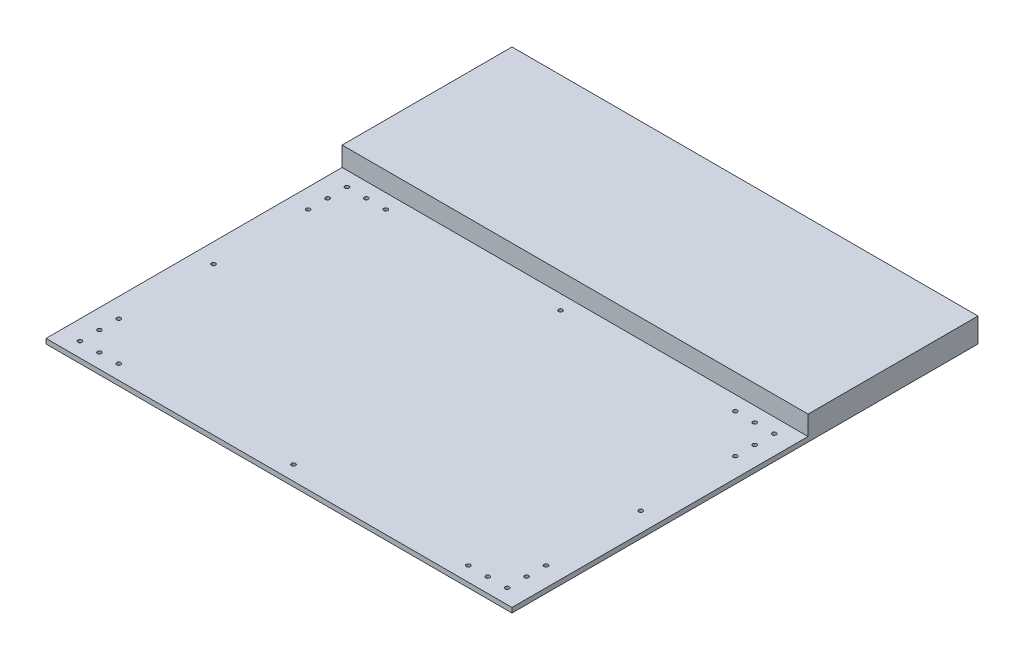
ISO-10303-21;
HEADER;
FILE_DESCRIPTION(('STEP AP214'),'2;1');
FILE_NAME('part.step','',(''),(''),'','','');
FILE_SCHEMA(('AUTOMOTIVE_DESIGN { 1 0 10303 214 1 1 1 1 }'));
ENDSEC;
DATA;
#1=APPLICATION_CONTEXT('core data for automotive mechanical design processes');
#2=APPLICATION_PROTOCOL_DEFINITION('international standard','automotive_design',2000,#1);
#3=PRODUCT_CONTEXT('',#1,'mechanical');
#4=PRODUCT('Part','Part','',(#3));
#5=PRODUCT_RELATED_PRODUCT_CATEGORY('part','',(#4));
#6=PRODUCT_DEFINITION_FORMATION('','',#4);
#7=PRODUCT_DEFINITION_CONTEXT('part definition',#1,'design');
#8=PRODUCT_DEFINITION('design','',#6,#7);
#9=PRODUCT_DEFINITION_SHAPE('','',#8);
#10=(LENGTH_UNIT() NAMED_UNIT(*) SI_UNIT(.MILLI.,.METRE.));
#11=(NAMED_UNIT(*) PLANE_ANGLE_UNIT() SI_UNIT($,.RADIAN.));
#12=(NAMED_UNIT(*) SI_UNIT($,.STERADIAN.) SOLID_ANGLE_UNIT());
#13=UNCERTAINTY_MEASURE_WITH_UNIT(LENGTH_MEASURE(1.E-05),#10,'distance_accuracy_value','');
#14=(GEOMETRIC_REPRESENTATION_CONTEXT(3) GLOBAL_UNCERTAINTY_ASSIGNED_CONTEXT((#13)) GLOBAL_UNIT_ASSIGNED_CONTEXT((#10,
#11,#12)) REPRESENTATION_CONTEXT('',''));
#15=CARTESIAN_POINT('',(0.,0.,0.));
#16=DIRECTION('',(0.,0.,1.));
#17=DIRECTION('',(1.,0.,0.));
#18=AXIS2_PLACEMENT_3D('',#15,#16,#17);
#19=CARTESIAN_POINT('',(0.,6.35,0.));
#20=DIRECTION('',(0.,-1.,0.));
#21=DIRECTION('',(0.,0.,-1.));
#22=AXIS2_PLACEMENT_3D('',#19,#20,#21);
#23=PLANE('',#22);
#24=CARTESIAN_POINT('',(25.4,6.35,-368.3));
#25=DIRECTION('',(0.,1.,0.));
#26=DIRECTION('',(0.,0.,1.));
#27=AXIS2_PLACEMENT_3D('',#24,#25,#26);
#28=CIRCLE('',#27,2.64999999999999);
#29=CARTESIAN_POINT('',(25.4,6.35,-365.65));
#30=VERTEX_POINT('',#29);
#31=EDGE_CURVE('E368',#30,#30,#28,.T.);
#32=ORIENTED_EDGE('',*,*,#31,.F.);
#33=EDGE_LOOP('',(#32));
#34=FACE_BOUND('',#33,.T.);
#35=CARTESIAN_POINT('',(50.8,6.35,-368.3));
#36=DIRECTION('',(0.,1.,0.));
#37=DIRECTION('',(0.,0.,1.));
#38=AXIS2_PLACEMENT_3D('',#35,#36,#37);
#39=CIRCLE('',#38,2.64999999999999);
#40=CARTESIAN_POINT('',(50.8,6.35,-365.65));
#41=VERTEX_POINT('',#40);
#42=EDGE_CURVE('E360',#41,#41,#39,.T.);
#43=ORIENTED_EDGE('',*,*,#42,.F.);
#44=EDGE_LOOP('',(#43));
#45=FACE_BOUND('',#44,.T.);
#46=CARTESIAN_POINT('',(76.2,6.35,-368.3));
#47=DIRECTION('',(0.,1.,0.));
#48=DIRECTION('',(0.,0.,1.));
#49=AXIS2_PLACEMENT_3D('',#46,#47,#48);
#50=CIRCLE('',#49,2.64999999999999);
#51=CARTESIAN_POINT('',(76.2,6.35,-365.65));
#52=VERTEX_POINT('',#51);
#53=EDGE_CURVE('E352',#52,#52,#50,.T.);
#54=ORIENTED_EDGE('',*,*,#53,.F.);
#55=EDGE_LOOP('',(#54));
#56=FACE_BOUND('',#55,.T.);
#57=CARTESIAN_POINT('',(25.4,6.35,-342.9));
#58=DIRECTION('',(0.,1.,0.));
#59=DIRECTION('',(0.,0.,1.));
#60=AXIS2_PLACEMENT_3D('',#57,#58,#59);
#61=CIRCLE('',#60,2.64999999999999);
#62=CARTESIAN_POINT('',(25.4,6.35,-340.25));
#63=VERTEX_POINT('',#62);
#64=EDGE_CURVE('E344',#63,#63,#61,.T.);
#65=ORIENTED_EDGE('',*,*,#64,.F.);
#66=EDGE_LOOP('',(#65));
#67=FACE_BOUND('',#66,.T.);
#68=CARTESIAN_POINT('',(25.4,6.35,-317.5));
#69=DIRECTION('',(0.,1.,0.));
#70=DIRECTION('',(0.,0.,1.));
#71=AXIS2_PLACEMENT_3D('',#68,#69,#70);
#72=CIRCLE('',#71,2.64999999999999);
#73=CARTESIAN_POINT('',(25.4,6.35,-314.85));
#74=VERTEX_POINT('',#73);
#75=EDGE_CURVE('E336',#74,#74,#72,.T.);
#76=ORIENTED_EDGE('',*,*,#75,.F.);
#77=EDGE_LOOP('',(#76));
#78=FACE_BOUND('',#77,.T.);
#79=CARTESIAN_POINT('',(25.4,6.35,-69.85));
#80=DIRECTION('',(0.,1.,0.));
#81=DIRECTION('',(0.,0.,1.));
#82=AXIS2_PLACEMENT_3D('',#79,#80,#81);
#83=CIRCLE('',#82,2.64999999999999);
#84=CARTESIAN_POINT('',(25.4,6.35,-67.2));
#85=VERTEX_POINT('',#84);
#86=EDGE_CURVE('E328',#85,#85,#83,.T.);
#87=ORIENTED_EDGE('',*,*,#86,.F.);
#88=EDGE_LOOP('',(#87));
#89=FACE_BOUND('',#88,.T.);
#90=CARTESIAN_POINT('',(25.4,6.35,-44.45));
#91=DIRECTION('',(0.,1.,0.));
#92=DIRECTION('',(0.,0.,1.));
#93=AXIS2_PLACEMENT_3D('',#90,#91,#92);
#94=CIRCLE('',#93,2.64999999999999);
#95=CARTESIAN_POINT('',(25.4,6.35,-41.8));
#96=VERTEX_POINT('',#95);
#97=EDGE_CURVE('E320',#96,#96,#94,.T.);
#98=ORIENTED_EDGE('',*,*,#97,.F.);
#99=EDGE_LOOP('',(#98));
#100=FACE_BOUND('',#99,.T.);
#101=CARTESIAN_POINT('',(25.4,6.35,-19.05));
#102=DIRECTION('',(0.,1.,0.));
#103=DIRECTION('',(0.,0.,1.));
#104=AXIS2_PLACEMENT_3D('',#101,#102,#103);
#105=CIRCLE('',#104,2.64999999999999);
#106=CARTESIAN_POINT('',(25.4,6.35,-16.4));
#107=VERTEX_POINT('',#106);
#108=EDGE_CURVE('E312',#107,#107,#105,.T.);
#109=ORIENTED_EDGE('',*,*,#108,.F.);
#110=EDGE_LOOP('',(#109));
#111=FACE_BOUND('',#110,.T.);
#112=CARTESIAN_POINT('',(50.8,6.35,-19.05));
#113=DIRECTION('',(0.,1.,0.));
#114=DIRECTION('',(0.,0.,1.));
#115=AXIS2_PLACEMENT_3D('',#112,#113,#114);
#116=CIRCLE('',#115,2.64999999999999);
#117=CARTESIAN_POINT('',(50.8,6.35,-16.4));
#118=VERTEX_POINT('',#117);
#119=EDGE_CURVE('E304',#118,#118,#116,.T.);
#120=ORIENTED_EDGE('',*,*,#119,.F.);
#121=EDGE_LOOP('',(#120));
#122=FACE_BOUND('',#121,.T.);
#123=CARTESIAN_POINT('',(76.2,6.35,-19.05));
#124=DIRECTION('',(0.,1.,0.));
#125=DIRECTION('',(0.,0.,1.));
#126=AXIS2_PLACEMENT_3D('',#123,#124,#125);
#127=CIRCLE('',#126,2.64999999999999);
#128=CARTESIAN_POINT('',(76.2,6.35,-16.4));
#129=VERTEX_POINT('',#128);
#130=EDGE_CURVE('E296',#129,#129,#127,.T.);
#131=ORIENTED_EDGE('',*,*,#130,.F.);
#132=EDGE_LOOP('',(#131));
#133=FACE_BOUND('',#132,.T.);
#134=CARTESIAN_POINT('',(304.8,6.35,-19.05));
#135=DIRECTION('',(0.,1.,0.));
#136=DIRECTION('',(0.,0.,1.));
#137=AXIS2_PLACEMENT_3D('',#134,#135,#136);
#138=CIRCLE('',#137,2.64999999999999);
#139=CARTESIAN_POINT('',(304.8,6.35,-16.4));
#140=VERTEX_POINT('',#139);
#141=EDGE_CURVE('E288',#140,#140,#138,.T.);
#142=ORIENTED_EDGE('',*,*,#141,.F.);
#143=EDGE_LOOP('',(#142));
#144=FACE_BOUND('',#143,.T.);
#145=CARTESIAN_POINT('',(25.4,6.35,-193.675));
#146=DIRECTION('',(0.,1.,0.));
#147=DIRECTION('',(0.,0.,1.));
#148=AXIS2_PLACEMENT_3D('',#145,#146,#147);
#149=CIRCLE('',#148,2.64999999999999);
#150=CARTESIAN_POINT('',(25.4,6.35,-191.025));
#151=VERTEX_POINT('',#150);
#152=EDGE_CURVE('E280',#151,#151,#149,.T.);
#153=ORIENTED_EDGE('',*,*,#152,.F.);
#154=EDGE_LOOP('',(#153));
#155=FACE_BOUND('',#154,.T.);
#156=CARTESIAN_POINT('',(304.8,6.35,-368.3));
#157=DIRECTION('',(0.,1.,0.));
#158=DIRECTION('',(0.,0.,1.));
#159=AXIS2_PLACEMENT_3D('',#156,#157,#158);
#160=CIRCLE('',#159,2.64999999999999);
#161=CARTESIAN_POINT('',(304.8,6.35,-365.65));
#162=VERTEX_POINT('',#161);
#163=EDGE_CURVE('E272',#162,#162,#160,.T.);
#164=ORIENTED_EDGE('',*,*,#163,.F.);
#165=EDGE_LOOP('',(#164));
#166=FACE_BOUND('',#165,.T.);
#167=CARTESIAN_POINT('',(584.2,6.35,-193.675));
#168=DIRECTION('',(0.,1.,0.));
#169=DIRECTION('',(0.,0.,1.));
#170=AXIS2_PLACEMENT_3D('',#167,#168,#169);
#171=CIRCLE('',#170,2.65000000000004);
#172=CARTESIAN_POINT('',(584.2,6.35,-191.025));
#173=VERTEX_POINT('',#172);
#174=EDGE_CURVE('E264',#173,#173,#171,.T.);
#175=ORIENTED_EDGE('',*,*,#174,.F.);
#176=EDGE_LOOP('',(#175));
#177=FACE_BOUND('',#176,.T.);
#178=CARTESIAN_POINT('',(533.4,6.35,-368.3));
#179=DIRECTION('',(0.,1.,0.));
#180=DIRECTION('',(0.,0.,1.));
#181=AXIS2_PLACEMENT_3D('',#178,#179,#180);
#182=CIRCLE('',#181,2.65000000000004);
#183=CARTESIAN_POINT('',(533.4,6.35,-365.65));
#184=VERTEX_POINT('',#183);
#185=EDGE_CURVE('E256',#184,#184,#182,.T.);
#186=ORIENTED_EDGE('',*,*,#185,.F.);
#187=EDGE_LOOP('',(#186));
#188=FACE_BOUND('',#187,.T.);
#189=CARTESIAN_POINT('',(558.8,6.35,-368.3));
#190=DIRECTION('',(0.,1.,0.));
#191=DIRECTION('',(0.,0.,1.));
#192=AXIS2_PLACEMENT_3D('',#189,#190,#191);
#193=CIRCLE('',#192,2.65000000000004);
#194=CARTESIAN_POINT('',(558.8,6.35,-365.65));
#195=VERTEX_POINT('',#194);
#196=EDGE_CURVE('E248',#195,#195,#193,.T.);
#197=ORIENTED_EDGE('',*,*,#196,.F.);
#198=EDGE_LOOP('',(#197));
#199=FACE_BOUND('',#198,.T.);
#200=CARTESIAN_POINT('',(584.2,6.35,-368.3));
#201=DIRECTION('',(0.,1.,0.));
#202=DIRECTION('',(0.,0.,1.));
#203=AXIS2_PLACEMENT_3D('',#200,#201,#202);
#204=CIRCLE('',#203,2.65000000000004);
#205=CARTESIAN_POINT('',(584.2,6.35,-365.65));
#206=VERTEX_POINT('',#205);
#207=EDGE_CURVE('E240',#206,#206,#204,.T.);
#208=ORIENTED_EDGE('',*,*,#207,.F.);
#209=EDGE_LOOP('',(#208));
#210=FACE_BOUND('',#209,.T.);
#211=CARTESIAN_POINT('',(584.2,6.35,-342.9));
#212=DIRECTION('',(0.,1.,0.));
#213=DIRECTION('',(0.,0.,1.));
#214=AXIS2_PLACEMENT_3D('',#211,#212,#213);
#215=CIRCLE('',#214,2.65000000000004);
#216=CARTESIAN_POINT('',(584.2,6.35,-340.25));
#217=VERTEX_POINT('',#216);
#218=EDGE_CURVE('E232',#217,#217,#215,.T.);
#219=ORIENTED_EDGE('',*,*,#218,.F.);
#220=EDGE_LOOP('',(#219));
#221=FACE_BOUND('',#220,.T.);
#222=CARTESIAN_POINT('',(584.2,6.35,-317.5));
#223=DIRECTION('',(0.,1.,0.));
#224=DIRECTION('',(0.,0.,1.));
#225=AXIS2_PLACEMENT_3D('',#222,#223,#224);
#226=CIRCLE('',#225,2.65000000000004);
#227=CARTESIAN_POINT('',(584.2,6.35,-314.85));
#228=VERTEX_POINT('',#227);
#229=EDGE_CURVE('E224',#228,#228,#226,.T.);
#230=ORIENTED_EDGE('',*,*,#229,.F.);
#231=EDGE_LOOP('',(#230));
#232=FACE_BOUND('',#231,.T.);
#233=CARTESIAN_POINT('',(584.2,6.35,-69.85));
#234=DIRECTION('',(0.,1.,0.));
#235=DIRECTION('',(0.,0.,1.));
#236=AXIS2_PLACEMENT_3D('',#233,#234,#235);
#237=CIRCLE('',#236,2.65000000000004);
#238=CARTESIAN_POINT('',(584.2,6.35,-67.1999999999999));
#239=VERTEX_POINT('',#238);
#240=EDGE_CURVE('E216',#239,#239,#237,.T.);
#241=ORIENTED_EDGE('',*,*,#240,.F.);
#242=EDGE_LOOP('',(#241));
#243=FACE_BOUND('',#242,.T.);
#244=CARTESIAN_POINT('',(584.2,6.35,-44.45));
#245=DIRECTION('',(0.,1.,0.));
#246=DIRECTION('',(0.,0.,1.));
#247=AXIS2_PLACEMENT_3D('',#244,#245,#246);
#248=CIRCLE('',#247,2.65000000000004);
#249=CARTESIAN_POINT('',(584.2,6.35,-41.7999999999999));
#250=VERTEX_POINT('',#249);
#251=EDGE_CURVE('E208',#250,#250,#248,.T.);
#252=ORIENTED_EDGE('',*,*,#251,.F.);
#253=EDGE_LOOP('',(#252));
#254=FACE_BOUND('',#253,.T.);
#255=CARTESIAN_POINT('',(584.2,6.35,-19.05));
#256=DIRECTION('',(0.,1.,0.));
#257=DIRECTION('',(0.,0.,1.));
#258=AXIS2_PLACEMENT_3D('',#255,#256,#257);
#259=CIRCLE('',#258,2.65000000000004);
#260=CARTESIAN_POINT('',(584.2,6.35,-16.4));
#261=VERTEX_POINT('',#260);
#262=EDGE_CURVE('E200',#261,#261,#259,.T.);
#263=ORIENTED_EDGE('',*,*,#262,.F.);
#264=EDGE_LOOP('',(#263));
#265=FACE_BOUND('',#264,.T.);
#266=CARTESIAN_POINT('',(558.8,6.35,-19.05));
#267=DIRECTION('',(0.,1.,0.));
#268=DIRECTION('',(0.,0.,1.));
#269=AXIS2_PLACEMENT_3D('',#266,#267,#268);
#270=CIRCLE('',#269,2.65000000000004);
#271=CARTESIAN_POINT('',(558.8,6.35,-16.4));
#272=VERTEX_POINT('',#271);
#273=EDGE_CURVE('E192',#272,#272,#270,.T.);
#274=ORIENTED_EDGE('',*,*,#273,.F.);
#275=EDGE_LOOP('',(#274));
#276=FACE_BOUND('',#275,.T.);
#277=CARTESIAN_POINT('',(533.4,6.35,-19.05));
#278=DIRECTION('',(0.,1.,0.));
#279=DIRECTION('',(0.,0.,1.));
#280=AXIS2_PLACEMENT_3D('',#277,#278,#279);
#281=CIRCLE('',#280,2.65000000000004);
#282=CARTESIAN_POINT('',(533.4,6.35,-16.4));
#283=VERTEX_POINT('',#282);
#284=EDGE_CURVE('E184',#283,#283,#281,.T.);
#285=ORIENTED_EDGE('',*,*,#284,.F.);
#286=EDGE_LOOP('',(#285));
#287=FACE_BOUND('',#286,.T.);
#288=DIRECTION('',(1.,0.,0.));
#289=VECTOR('',#288,1.);
#290=CARTESIAN_POINT('',(0.,6.35,-387.35));
#291=LINE('',#290,#289);
#292=CARTESIAN_POINT('',(0.,6.35,-387.35));
#293=VERTEX_POINT('',#292);
#294=CARTESIAN_POINT('',(609.6,6.35,-387.35));
#295=VERTEX_POINT('',#294);
#296=EDGE_CURVE('E67',#293,#295,#291,.T.);
#297=ORIENTED_EDGE('',*,*,#296,.F.);
#298=DIRECTION('',(0.,0.,1.));
#299=VECTOR('',#298,1.);
#300=CARTESIAN_POINT('',(0.,6.35,0.));
#301=LINE('',#300,#299);
#302=CARTESIAN_POINT('',(0.,6.35,0.));
#303=VERTEX_POINT('',#302);
#304=EDGE_CURVE('E106',#293,#303,#301,.T.);
#305=ORIENTED_EDGE('',*,*,#304,.T.);
#306=DIRECTION('',(1.,0.,0.));
#307=VECTOR('',#306,1.);
#308=CARTESIAN_POINT('',(0.,6.35,0.));
#309=LINE('',#308,#307);
#310=CARTESIAN_POINT('',(609.6,6.35,0.));
#311=VERTEX_POINT('',#310);
#312=EDGE_CURVE('E73',#303,#311,#309,.T.);
#313=ORIENTED_EDGE('',*,*,#312,.T.);
#314=DIRECTION('',(0.,0.,-1.));
#315=VECTOR('',#314,1.);
#316=CARTESIAN_POINT('',(609.6,6.35,0.));
#317=LINE('',#316,#315);
#318=EDGE_CURVE('E118',#311,#295,#317,.T.);
#319=ORIENTED_EDGE('',*,*,#318,.T.);
#320=EDGE_LOOP('',(#297,#305,#313,#319));
#321=FACE_BOUND('',#320,.T.);
#322=ADVANCED_FACE('F51',(#34,#45,#56,#67,#78,#89,#100,#111,#122,#133,#144,#155,#166,#177,#188,
#199,#210,#221,#232,#243,#254,#265,#276,#287,#321),#23,.F.);
#323=CARTESIAN_POINT('',(0.,6.35,0.));
#324=DIRECTION('',(1.,0.,0.));
#325=DIRECTION('',(0.,0.,-1.));
#326=AXIS2_PLACEMENT_3D('',#323,#324,#325);
#327=PLANE('',#326);
#328=DIRECTION('',(0.,0.,1.));
#329=VECTOR('',#328,1.);
#330=CARTESIAN_POINT('',(0.,0.,0.));
#331=LINE('',#330,#329);
#332=CARTESIAN_POINT('',(0.,0.,-609.6));
#333=VERTEX_POINT('',#332);
#334=CARTESIAN_POINT('',(0.,0.,0.));
#335=VERTEX_POINT('',#334);
#336=EDGE_CURVE('E112',#333,#335,#331,.T.);
#337=ORIENTED_EDGE('',*,*,#336,.T.);
#338=DIRECTION('',(0.,-1.,0.));
#339=VECTOR('',#338,1.);
#340=CARTESIAN_POINT('',(0.,6.35,0.));
#341=LINE('',#340,#339);
#342=EDGE_CURVE('E11',#303,#335,#341,.T.);
#343=ORIENTED_EDGE('',*,*,#342,.F.);
#344=ORIENTED_EDGE('',*,*,#304,.F.);
#345=DIRECTION('',(0.,-1.,0.));
#346=VECTOR('',#345,1.);
#347=CARTESIAN_POINT('',(0.,31.75,-387.35));
#348=LINE('',#347,#346);
#349=CARTESIAN_POINT('',(0.,31.75,-387.35));
#350=VERTEX_POINT('',#349);
#351=EDGE_CURVE('E129',#350,#293,#348,.T.);
#352=ORIENTED_EDGE('',*,*,#351,.F.);
#353=DIRECTION('',(0.,0.,1.));
#354=VECTOR('',#353,1.);
#355=CARTESIAN_POINT('',(0.,31.75,-609.6));
#356=LINE('',#355,#354);
#357=CARTESIAN_POINT('',(0.,31.75,-609.6));
#358=VERTEX_POINT('',#357);
#359=EDGE_CURVE('E115',#358,#350,#356,.T.);
#360=ORIENTED_EDGE('',*,*,#359,.F.);
#361=DIRECTION('',(0.,-1.,0.));
#362=VECTOR('',#361,1.);
#363=CARTESIAN_POINT('',(0.,6.35,-609.6));
#364=LINE('',#363,#362);
#365=EDGE_CURVE('E98',#358,#333,#364,.T.);
#366=ORIENTED_EDGE('',*,*,#365,.T.);
#367=EDGE_LOOP('',(#337,#343,#344,#352,#360,#366));
#368=FACE_BOUND('',#367,.T.);
#369=ADVANCED_FACE('F53',(#368),#327,.F.);
#370=CARTESIAN_POINT('',(0.,6.35,0.));
#371=DIRECTION('',(0.,0.,-1.));
#372=DIRECTION('',(-1.,0.,0.));
#373=AXIS2_PLACEMENT_3D('',#370,#371,#372);
#374=PLANE('',#373);
#375=DIRECTION('',(1.,0.,0.));
#376=VECTOR('',#375,1.);
#377=CARTESIAN_POINT('',(0.,0.,0.));
#378=LINE('',#377,#376);
#379=CARTESIAN_POINT('',(609.6,0.,0.));
#380=VERTEX_POINT('',#379);
#381=EDGE_CURVE('E121',#335,#380,#378,.T.);
#382=ORIENTED_EDGE('',*,*,#381,.T.);
#383=DIRECTION('',(0.,-1.,0.));
#384=VECTOR('',#383,1.);
#385=CARTESIAN_POINT('',(609.6,6.35,0.));
#386=LINE('',#385,#384);
#387=EDGE_CURVE('E60',#311,#380,#386,.T.);
#388=ORIENTED_EDGE('',*,*,#387,.F.);
#389=ORIENTED_EDGE('',*,*,#312,.F.);
#390=ORIENTED_EDGE('',*,*,#342,.T.);
#391=EDGE_LOOP('',(#382,#388,#389,#390));
#392=FACE_BOUND('',#391,.T.);
#393=ADVANCED_FACE('F143',(#392),#374,.F.);
#394=CARTESIAN_POINT('',(609.6,6.35,0.));
#395=DIRECTION('',(-1.,0.,0.));
#396=DIRECTION('',(0.,0.,1.));
#397=AXIS2_PLACEMENT_3D('',#394,#395,#396);
#398=PLANE('',#397);
#399=DIRECTION('',(0.,0.,-1.));
#400=VECTOR('',#399,1.);
#401=CARTESIAN_POINT('',(609.6,0.,0.));
#402=LINE('',#401,#400);
#403=CARTESIAN_POINT('',(609.6,0.,-609.6));
#404=VERTEX_POINT('',#403);
#405=EDGE_CURVE('E107',#380,#404,#402,.T.);
#406=ORIENTED_EDGE('',*,*,#405,.T.);
#407=DIRECTION('',(0.,-1.,0.));
#408=VECTOR('',#407,1.);
#409=CARTESIAN_POINT('',(609.6,6.35,-609.6));
#410=LINE('',#409,#408);
#411=CARTESIAN_POINT('',(609.6,31.75,-609.6));
#412=VERTEX_POINT('',#411);
#413=EDGE_CURVE('E101',#412,#404,#410,.T.);
#414=ORIENTED_EDGE('',*,*,#413,.F.);
#415=DIRECTION('',(0.,0.,1.));
#416=VECTOR('',#415,1.);
#417=CARTESIAN_POINT('',(609.6,31.75,-609.6));
#418=LINE('',#417,#416);
#419=CARTESIAN_POINT('',(609.6,31.75,-387.35));
#420=VERTEX_POINT('',#419);
#421=EDGE_CURVE('E165',#412,#420,#418,.T.);
#422=ORIENTED_EDGE('',*,*,#421,.T.);
#423=DIRECTION('',(0.,-1.,0.));
#424=VECTOR('',#423,1.);
#425=CARTESIAN_POINT('',(609.6,31.75,-387.35));
#426=LINE('',#425,#424);
#427=EDGE_CURVE('E123',#420,#295,#426,.T.);
#428=ORIENTED_EDGE('',*,*,#427,.T.);
#429=ORIENTED_EDGE('',*,*,#318,.F.);
#430=ORIENTED_EDGE('',*,*,#387,.T.);
#431=EDGE_LOOP('',(#406,#414,#422,#428,#429,#430));
#432=FACE_BOUND('',#431,.T.);
#433=ADVANCED_FACE('F141',(#432),#398,.F.);
#434=CARTESIAN_POINT('',(0.,6.35,-609.6));
#435=DIRECTION('',(0.,0.,1.));
#436=DIRECTION('',(1.,0.,0.));
#437=AXIS2_PLACEMENT_3D('',#434,#435,#436);
#438=PLANE('',#437);
#439=DIRECTION('',(-1.,0.,0.));
#440=VECTOR('',#439,1.);
#441=CARTESIAN_POINT('',(0.,0.,-609.6));
#442=LINE('',#441,#440);
#443=EDGE_CURVE('E93',#404,#333,#442,.T.);
#444=ORIENTED_EDGE('',*,*,#443,.T.);
#445=ORIENTED_EDGE('',*,*,#365,.F.);
#446=DIRECTION('',(1.,0.,0.));
#447=VECTOR('',#446,1.);
#448=CARTESIAN_POINT('',(0.,31.75,-609.6));
#449=LINE('',#448,#447);
#450=EDGE_CURVE('E157',#358,#412,#449,.T.);
#451=ORIENTED_EDGE('',*,*,#450,.T.);
#452=ORIENTED_EDGE('',*,*,#413,.T.);
#453=EDGE_LOOP('',(#444,#445,#451,#452));
#454=FACE_BOUND('',#453,.T.);
#455=ADVANCED_FACE('F95',(#454),#438,.F.);
#456=CARTESIAN_POINT('',(0.,0.,0.));
#457=DIRECTION('',(0.,-1.,0.));
#458=DIRECTION('',(0.,0.,-1.));
#459=AXIS2_PLACEMENT_3D('',#456,#457,#458);
#460=PLANE('',#459);
#461=CARTESIAN_POINT('',(25.4,0.,-368.3));
#462=DIRECTION('',(0.,1.,0.));
#463=DIRECTION('',(0.,0.,1.));
#464=AXIS2_PLACEMENT_3D('',#461,#462,#463);
#465=CIRCLE('',#464,2.65);
#466=CARTESIAN_POINT('',(25.4,0.,-365.65));
#467=VERTEX_POINT('',#466);
#468=EDGE_CURVE('E364',#467,#467,#465,.T.);
#469=ORIENTED_EDGE('',*,*,#468,.T.);
#470=EDGE_LOOP('',(#469));
#471=FACE_BOUND('',#470,.T.);
#472=CARTESIAN_POINT('',(50.8,0.,-368.3));
#473=DIRECTION('',(0.,1.,0.));
#474=DIRECTION('',(0.,0.,1.));
#475=AXIS2_PLACEMENT_3D('',#472,#473,#474);
#476=CIRCLE('',#475,2.65);
#477=CARTESIAN_POINT('',(50.8,0.,-365.65));
#478=VERTEX_POINT('',#477);
#479=EDGE_CURVE('E356',#478,#478,#476,.T.);
#480=ORIENTED_EDGE('',*,*,#479,.T.);
#481=EDGE_LOOP('',(#480));
#482=FACE_BOUND('',#481,.T.);
#483=CARTESIAN_POINT('',(76.2,0.,-368.3));
#484=DIRECTION('',(0.,1.,0.));
#485=DIRECTION('',(0.,0.,1.));
#486=AXIS2_PLACEMENT_3D('',#483,#484,#485);
#487=CIRCLE('',#486,2.65);
#488=CARTESIAN_POINT('',(76.2,0.,-365.65));
#489=VERTEX_POINT('',#488);
#490=EDGE_CURVE('E348',#489,#489,#487,.T.);
#491=ORIENTED_EDGE('',*,*,#490,.T.);
#492=EDGE_LOOP('',(#491));
#493=FACE_BOUND('',#492,.T.);
#494=CARTESIAN_POINT('',(25.4,0.,-342.9));
#495=DIRECTION('',(0.,1.,0.));
#496=DIRECTION('',(0.,0.,1.));
#497=AXIS2_PLACEMENT_3D('',#494,#495,#496);
#498=CIRCLE('',#497,2.65);
#499=CARTESIAN_POINT('',(25.4,0.,-340.25));
#500=VERTEX_POINT('',#499);
#501=EDGE_CURVE('E340',#500,#500,#498,.T.);
#502=ORIENTED_EDGE('',*,*,#501,.T.);
#503=EDGE_LOOP('',(#502));
#504=FACE_BOUND('',#503,.T.);
#505=CARTESIAN_POINT('',(25.4,0.,-317.5));
#506=DIRECTION('',(0.,1.,0.));
#507=DIRECTION('',(0.,0.,1.));
#508=AXIS2_PLACEMENT_3D('',#505,#506,#507);
#509=CIRCLE('',#508,2.65);
#510=CARTESIAN_POINT('',(25.4,0.,-314.85));
#511=VERTEX_POINT('',#510);
#512=EDGE_CURVE('E332',#511,#511,#509,.T.);
#513=ORIENTED_EDGE('',*,*,#512,.T.);
#514=EDGE_LOOP('',(#513));
#515=FACE_BOUND('',#514,.T.);
#516=CARTESIAN_POINT('',(25.4,0.,-69.85));
#517=DIRECTION('',(0.,1.,0.));
#518=DIRECTION('',(0.,0.,1.));
#519=AXIS2_PLACEMENT_3D('',#516,#517,#518);
#520=CIRCLE('',#519,2.65);
#521=CARTESIAN_POINT('',(25.4,0.,-67.2));
#522=VERTEX_POINT('',#521);
#523=EDGE_CURVE('E324',#522,#522,#520,.T.);
#524=ORIENTED_EDGE('',*,*,#523,.T.);
#525=EDGE_LOOP('',(#524));
#526=FACE_BOUND('',#525,.T.);
#527=CARTESIAN_POINT('',(25.4,0.,-44.45));
#528=DIRECTION('',(0.,1.,0.));
#529=DIRECTION('',(0.,0.,1.));
#530=AXIS2_PLACEMENT_3D('',#527,#528,#529);
#531=CIRCLE('',#530,2.65);
#532=CARTESIAN_POINT('',(25.4,0.,-41.8));
#533=VERTEX_POINT('',#532);
#534=EDGE_CURVE('E316',#533,#533,#531,.T.);
#535=ORIENTED_EDGE('',*,*,#534,.T.);
#536=EDGE_LOOP('',(#535));
#537=FACE_BOUND('',#536,.T.);
#538=CARTESIAN_POINT('',(25.4,0.,-19.05));
#539=DIRECTION('',(0.,1.,0.));
#540=DIRECTION('',(0.,0.,1.));
#541=AXIS2_PLACEMENT_3D('',#538,#539,#540);
#542=CIRCLE('',#541,2.65);
#543=CARTESIAN_POINT('',(25.4,0.,-16.4));
#544=VERTEX_POINT('',#543);
#545=EDGE_CURVE('E308',#544,#544,#542,.T.);
#546=ORIENTED_EDGE('',*,*,#545,.T.);
#547=EDGE_LOOP('',(#546));
#548=FACE_BOUND('',#547,.T.);
#549=CARTESIAN_POINT('',(50.8,0.,-19.05));
#550=DIRECTION('',(0.,1.,0.));
#551=DIRECTION('',(0.,0.,1.));
#552=AXIS2_PLACEMENT_3D('',#549,#550,#551);
#553=CIRCLE('',#552,2.65);
#554=CARTESIAN_POINT('',(50.8,0.,-16.4));
#555=VERTEX_POINT('',#554);
#556=EDGE_CURVE('E300',#555,#555,#553,.T.);
#557=ORIENTED_EDGE('',*,*,#556,.T.);
#558=EDGE_LOOP('',(#557));
#559=FACE_BOUND('',#558,.T.);
#560=CARTESIAN_POINT('',(76.2,0.,-19.05));
#561=DIRECTION('',(0.,1.,0.));
#562=DIRECTION('',(0.,0.,1.));
#563=AXIS2_PLACEMENT_3D('',#560,#561,#562);
#564=CIRCLE('',#563,2.65);
#565=CARTESIAN_POINT('',(76.2,0.,-16.4));
#566=VERTEX_POINT('',#565);
#567=EDGE_CURVE('E292',#566,#566,#564,.T.);
#568=ORIENTED_EDGE('',*,*,#567,.T.);
#569=EDGE_LOOP('',(#568));
#570=FACE_BOUND('',#569,.T.);
#571=CARTESIAN_POINT('',(304.8,0.,-19.05));
#572=DIRECTION('',(0.,1.,0.));
#573=DIRECTION('',(0.,0.,1.));
#574=AXIS2_PLACEMENT_3D('',#571,#572,#573);
#575=CIRCLE('',#574,2.64999999999999);
#576=CARTESIAN_POINT('',(304.8,0.,-16.4));
#577=VERTEX_POINT('',#576);
#578=EDGE_CURVE('E284',#577,#577,#575,.T.);
#579=ORIENTED_EDGE('',*,*,#578,.T.);
#580=EDGE_LOOP('',(#579));
#581=FACE_BOUND('',#580,.T.);
#582=CARTESIAN_POINT('',(25.4,0.,-193.675));
#583=DIRECTION('',(0.,1.,0.));
#584=DIRECTION('',(0.,0.,1.));
#585=AXIS2_PLACEMENT_3D('',#582,#583,#584);
#586=CIRCLE('',#585,2.65);
#587=CARTESIAN_POINT('',(25.4,0.,-191.025));
#588=VERTEX_POINT('',#587);
#589=EDGE_CURVE('E276',#588,#588,#586,.T.);
#590=ORIENTED_EDGE('',*,*,#589,.T.);
#591=EDGE_LOOP('',(#590));
#592=FACE_BOUND('',#591,.T.);
#593=CARTESIAN_POINT('',(304.8,0.,-368.3));
#594=DIRECTION('',(0.,1.,0.));
#595=DIRECTION('',(0.,0.,1.));
#596=AXIS2_PLACEMENT_3D('',#593,#594,#595);
#597=CIRCLE('',#596,2.64999999999999);
#598=CARTESIAN_POINT('',(304.8,0.,-365.65));
#599=VERTEX_POINT('',#598);
#600=EDGE_CURVE('E268',#599,#599,#597,.T.);
#601=ORIENTED_EDGE('',*,*,#600,.T.);
#602=EDGE_LOOP('',(#601));
#603=FACE_BOUND('',#602,.T.);
#604=CARTESIAN_POINT('',(584.2,0.,-193.675));
#605=DIRECTION('',(0.,1.,0.));
#606=DIRECTION('',(0.,0.,1.));
#607=AXIS2_PLACEMENT_3D('',#604,#605,#606);
#608=CIRCLE('',#607,2.65000000000004);
#609=CARTESIAN_POINT('',(584.2,0.,-191.025));
#610=VERTEX_POINT('',#609);
#611=EDGE_CURVE('E260',#610,#610,#608,.T.);
#612=ORIENTED_EDGE('',*,*,#611,.T.);
#613=EDGE_LOOP('',(#612));
#614=FACE_BOUND('',#613,.T.);
#615=CARTESIAN_POINT('',(533.4,0.,-368.3));
#616=DIRECTION('',(0.,1.,0.));
#617=DIRECTION('',(0.,0.,1.));
#618=AXIS2_PLACEMENT_3D('',#615,#616,#617);
#619=CIRCLE('',#618,2.65000000000004);
#620=CARTESIAN_POINT('',(533.4,0.,-365.65));
#621=VERTEX_POINT('',#620);
#622=EDGE_CURVE('E252',#621,#621,#619,.T.);
#623=ORIENTED_EDGE('',*,*,#622,.T.);
#624=EDGE_LOOP('',(#623));
#625=FACE_BOUND('',#624,.T.);
#626=CARTESIAN_POINT('',(558.8,0.,-368.3));
#627=DIRECTION('',(0.,1.,0.));
#628=DIRECTION('',(0.,0.,1.));
#629=AXIS2_PLACEMENT_3D('',#626,#627,#628);
#630=CIRCLE('',#629,2.65000000000004);
#631=CARTESIAN_POINT('',(558.8,0.,-365.65));
#632=VERTEX_POINT('',#631);
#633=EDGE_CURVE('E244',#632,#632,#630,.T.);
#634=ORIENTED_EDGE('',*,*,#633,.T.);
#635=EDGE_LOOP('',(#634));
#636=FACE_BOUND('',#635,.T.);
#637=CARTESIAN_POINT('',(584.2,0.,-368.3));
#638=DIRECTION('',(0.,1.,0.));
#639=DIRECTION('',(0.,0.,1.));
#640=AXIS2_PLACEMENT_3D('',#637,#638,#639);
#641=CIRCLE('',#640,2.65000000000004);
#642=CARTESIAN_POINT('',(584.2,0.,-365.65));
#643=VERTEX_POINT('',#642);
#644=EDGE_CURVE('E236',#643,#643,#641,.T.);
#645=ORIENTED_EDGE('',*,*,#644,.T.);
#646=EDGE_LOOP('',(#645));
#647=FACE_BOUND('',#646,.T.);
#648=CARTESIAN_POINT('',(584.2,0.,-342.9));
#649=DIRECTION('',(0.,1.,0.));
#650=DIRECTION('',(0.,0.,1.));
#651=AXIS2_PLACEMENT_3D('',#648,#649,#650);
#652=CIRCLE('',#651,2.65000000000004);
#653=CARTESIAN_POINT('',(584.2,0.,-340.25));
#654=VERTEX_POINT('',#653);
#655=EDGE_CURVE('E228',#654,#654,#652,.T.);
#656=ORIENTED_EDGE('',*,*,#655,.T.);
#657=EDGE_LOOP('',(#656));
#658=FACE_BOUND('',#657,.T.);
#659=CARTESIAN_POINT('',(584.2,0.,-317.5));
#660=DIRECTION('',(0.,1.,0.));
#661=DIRECTION('',(0.,0.,1.));
#662=AXIS2_PLACEMENT_3D('',#659,#660,#661);
#663=CIRCLE('',#662,2.65000000000004);
#664=CARTESIAN_POINT('',(584.2,0.,-314.85));
#665=VERTEX_POINT('',#664);
#666=EDGE_CURVE('E220',#665,#665,#663,.T.);
#667=ORIENTED_EDGE('',*,*,#666,.T.);
#668=EDGE_LOOP('',(#667));
#669=FACE_BOUND('',#668,.T.);
#670=CARTESIAN_POINT('',(584.2,0.,-69.85));
#671=DIRECTION('',(0.,1.,0.));
#672=DIRECTION('',(0.,0.,1.));
#673=AXIS2_PLACEMENT_3D('',#670,#671,#672);
#674=CIRCLE('',#673,2.65000000000004);
#675=CARTESIAN_POINT('',(584.2,0.,-67.1999999999999));
#676=VERTEX_POINT('',#675);
#677=EDGE_CURVE('E212',#676,#676,#674,.T.);
#678=ORIENTED_EDGE('',*,*,#677,.T.);
#679=EDGE_LOOP('',(#678));
#680=FACE_BOUND('',#679,.T.);
#681=CARTESIAN_POINT('',(584.2,0.,-44.45));
#682=DIRECTION('',(0.,1.,0.));
#683=DIRECTION('',(0.,0.,1.));
#684=AXIS2_PLACEMENT_3D('',#681,#682,#683);
#685=CIRCLE('',#684,2.65000000000004);
#686=CARTESIAN_POINT('',(584.2,0.,-41.7999999999999));
#687=VERTEX_POINT('',#686);
#688=EDGE_CURVE('E204',#687,#687,#685,.T.);
#689=ORIENTED_EDGE('',*,*,#688,.T.);
#690=EDGE_LOOP('',(#689));
#691=FACE_BOUND('',#690,.T.);
#692=CARTESIAN_POINT('',(584.2,0.,-19.05));
#693=DIRECTION('',(0.,1.,0.));
#694=DIRECTION('',(0.,0.,1.));
#695=AXIS2_PLACEMENT_3D('',#692,#693,#694);
#696=CIRCLE('',#695,2.65000000000004);
#697=CARTESIAN_POINT('',(584.2,0.,-16.4));
#698=VERTEX_POINT('',#697);
#699=EDGE_CURVE('E196',#698,#698,#696,.T.);
#700=ORIENTED_EDGE('',*,*,#699,.T.);
#701=EDGE_LOOP('',(#700));
#702=FACE_BOUND('',#701,.T.);
#703=CARTESIAN_POINT('',(558.8,0.,-19.05));
#704=DIRECTION('',(0.,1.,0.));
#705=DIRECTION('',(0.,0.,1.));
#706=AXIS2_PLACEMENT_3D('',#703,#704,#705);
#707=CIRCLE('',#706,2.65000000000004);
#708=CARTESIAN_POINT('',(558.8,0.,-16.4));
#709=VERTEX_POINT('',#708);
#710=EDGE_CURVE('E188',#709,#709,#707,.T.);
#711=ORIENTED_EDGE('',*,*,#710,.T.);
#712=EDGE_LOOP('',(#711));
#713=FACE_BOUND('',#712,.T.);
#714=CARTESIAN_POINT('',(533.4,0.,-19.05));
#715=DIRECTION('',(0.,1.,0.));
#716=DIRECTION('',(0.,0.,1.));
#717=AXIS2_PLACEMENT_3D('',#714,#715,#716);
#718=CIRCLE('',#717,2.65000000000004);
#719=CARTESIAN_POINT('',(533.4,0.,-16.4));
#720=VERTEX_POINT('',#719);
#721=EDGE_CURVE('E180',#720,#720,#718,.T.);
#722=ORIENTED_EDGE('',*,*,#721,.T.);
#723=EDGE_LOOP('',(#722));
#724=FACE_BOUND('',#723,.T.);
#725=ORIENTED_EDGE('',*,*,#336,.F.);
#726=ORIENTED_EDGE('',*,*,#443,.F.);
#727=ORIENTED_EDGE('',*,*,#405,.F.);
#728=ORIENTED_EDGE('',*,*,#381,.F.);
#729=EDGE_LOOP('',(#725,#726,#727,#728));
#730=FACE_BOUND('',#729,.T.);
#731=ADVANCED_FACE('F120',(#471,#482,#493,#504,#515,#526,#537,#548,#559,#570,#581,#592,#603,
#614,#625,#636,#647,#658,#669,#680,#691,#702,#713,#724,#730),#460,.T.);
#732=CARTESIAN_POINT('',(0.,31.75,-387.35));
#733=DIRECTION('',(0.,0.,-1.));
#734=DIRECTION('',(-1.,0.,0.));
#735=AXIS2_PLACEMENT_3D('',#732,#733,#734);
#736=PLANE('',#735);
#737=ORIENTED_EDGE('',*,*,#296,.T.);
#738=ORIENTED_EDGE('',*,*,#427,.F.);
#739=DIRECTION('',(1.,0.,0.));
#740=VECTOR('',#739,1.);
#741=CARTESIAN_POINT('',(0.,31.75,-387.35));
#742=LINE('',#741,#740);
#743=EDGE_CURVE('E153',#350,#420,#742,.T.);
#744=ORIENTED_EDGE('',*,*,#743,.F.);
#745=ORIENTED_EDGE('',*,*,#351,.T.);
#746=EDGE_LOOP('',(#737,#738,#744,#745));
#747=FACE_BOUND('',#746,.T.);
#748=ADVANCED_FACE('F149',(#747),#736,.F.);
#749=CARTESIAN_POINT('',(0.,31.75,0.));
#750=DIRECTION('',(0.,-1.,0.));
#751=DIRECTION('',(0.,0.,-1.));
#752=AXIS2_PLACEMENT_3D('',#749,#750,#751);
#753=PLANE('',#752);
#754=ORIENTED_EDGE('',*,*,#743,.T.);
#755=ORIENTED_EDGE('',*,*,#421,.F.);
#756=ORIENTED_EDGE('',*,*,#450,.F.);
#757=ORIENTED_EDGE('',*,*,#359,.T.);
#758=EDGE_LOOP('',(#754,#755,#756,#757));
#759=FACE_BOUND('',#758,.T.);
#760=ADVANCED_FACE('F172',(#759),#753,.F.);
#761=CARTESIAN_POINT('',(533.4,6.35,-19.05));
#762=DIRECTION('',(0.,1.,0.));
#763=DIRECTION('',(0.,0.,1.));
#764=AXIS2_PLACEMENT_3D('',#761,#762,#763);
#765=CYLINDRICAL_SURFACE('',#764,2.65000000000004);
#766=ORIENTED_EDGE('',*,*,#721,.F.);
#767=EDGE_LOOP('',(#766));
#768=FACE_BOUND('',#767,.T.);
#769=ORIENTED_EDGE('',*,*,#284,.T.);
#770=EDGE_LOOP('',(#769));
#771=FACE_BOUND('',#770,.T.);
#772=ADVANCED_FACE('F424',(#768,#771),#765,.F.);
#773=CARTESIAN_POINT('',(558.8,6.35,-19.05));
#774=DIRECTION('',(0.,1.,0.));
#775=DIRECTION('',(0.,0.,1.));
#776=AXIS2_PLACEMENT_3D('',#773,#774,#775);
#777=CYLINDRICAL_SURFACE('',#776,2.65000000000004);
#778=ORIENTED_EDGE('',*,*,#710,.F.);
#779=EDGE_LOOP('',(#778));
#780=FACE_BOUND('',#779,.T.);
#781=ORIENTED_EDGE('',*,*,#273,.T.);
#782=EDGE_LOOP('',(#781));
#783=FACE_BOUND('',#782,.T.);
#784=ADVANCED_FACE('F426',(#780,#783),#777,.F.);
#785=CARTESIAN_POINT('',(584.2,6.35,-19.05));
#786=DIRECTION('',(0.,1.,0.));
#787=DIRECTION('',(0.,0.,1.));
#788=AXIS2_PLACEMENT_3D('',#785,#786,#787);
#789=CYLINDRICAL_SURFACE('',#788,2.65000000000004);
#790=ORIENTED_EDGE('',*,*,#699,.F.);
#791=EDGE_LOOP('',(#790));
#792=FACE_BOUND('',#791,.T.);
#793=ORIENTED_EDGE('',*,*,#262,.T.);
#794=EDGE_LOOP('',(#793));
#795=FACE_BOUND('',#794,.T.);
#796=ADVANCED_FACE('F433',(#792,#795),#789,.F.);
#797=CARTESIAN_POINT('',(584.2,6.35,-44.45));
#798=DIRECTION('',(0.,1.,0.));
#799=DIRECTION('',(0.,0.,1.));
#800=AXIS2_PLACEMENT_3D('',#797,#798,#799);
#801=CYLINDRICAL_SURFACE('',#800,2.65000000000004);
#802=ORIENTED_EDGE('',*,*,#688,.F.);
#803=EDGE_LOOP('',(#802));
#804=FACE_BOUND('',#803,.T.);
#805=ORIENTED_EDGE('',*,*,#251,.T.);
#806=EDGE_LOOP('',(#805));
#807=FACE_BOUND('',#806,.T.);
#808=ADVANCED_FACE('F527',(#804,#807),#801,.F.);
#809=CARTESIAN_POINT('',(584.2,6.35,-69.85));
#810=DIRECTION('',(0.,1.,0.));
#811=DIRECTION('',(0.,0.,1.));
#812=AXIS2_PLACEMENT_3D('',#809,#810,#811);
#813=CYLINDRICAL_SURFACE('',#812,2.65000000000004);
#814=ORIENTED_EDGE('',*,*,#677,.F.);
#815=EDGE_LOOP('',(#814));
#816=FACE_BOUND('',#815,.T.);
#817=ORIENTED_EDGE('',*,*,#240,.T.);
#818=EDGE_LOOP('',(#817));
#819=FACE_BOUND('',#818,.T.);
#820=ADVANCED_FACE('F535',(#816,#819),#813,.F.);
#821=CARTESIAN_POINT('',(584.2,6.35,-317.5));
#822=DIRECTION('',(0.,1.,0.));
#823=DIRECTION('',(0.,0.,1.));
#824=AXIS2_PLACEMENT_3D('',#821,#822,#823);
#825=CYLINDRICAL_SURFACE('',#824,2.65000000000004);
#826=ORIENTED_EDGE('',*,*,#666,.F.);
#827=EDGE_LOOP('',(#826));
#828=FACE_BOUND('',#827,.T.);
#829=ORIENTED_EDGE('',*,*,#229,.T.);
#830=EDGE_LOOP('',(#829));
#831=FACE_BOUND('',#830,.T.);
#832=ADVANCED_FACE('F544',(#828,#831),#825,.F.);
#833=CARTESIAN_POINT('',(584.2,6.35,-342.9));
#834=DIRECTION('',(0.,1.,0.));
#835=DIRECTION('',(0.,0.,1.));
#836=AXIS2_PLACEMENT_3D('',#833,#834,#835);
#837=CYLINDRICAL_SURFACE('',#836,2.65000000000004);
#838=ORIENTED_EDGE('',*,*,#655,.F.);
#839=EDGE_LOOP('',(#838));
#840=FACE_BOUND('',#839,.T.);
#841=ORIENTED_EDGE('',*,*,#218,.T.);
#842=EDGE_LOOP('',(#841));
#843=FACE_BOUND('',#842,.T.);
#844=ADVANCED_FACE('F553',(#840,#843),#837,.F.);
#845=CARTESIAN_POINT('',(584.2,6.35,-368.3));
#846=DIRECTION('',(0.,1.,0.));
#847=DIRECTION('',(0.,0.,1.));
#848=AXIS2_PLACEMENT_3D('',#845,#846,#847);
#849=CYLINDRICAL_SURFACE('',#848,2.65000000000004);
#850=ORIENTED_EDGE('',*,*,#644,.F.);
#851=EDGE_LOOP('',(#850));
#852=FACE_BOUND('',#851,.T.);
#853=ORIENTED_EDGE('',*,*,#207,.T.);
#854=EDGE_LOOP('',(#853));
#855=FACE_BOUND('',#854,.T.);
#856=ADVANCED_FACE('F562',(#852,#855),#849,.F.);
#857=CARTESIAN_POINT('',(558.8,6.35,-368.3));
#858=DIRECTION('',(0.,1.,0.));
#859=DIRECTION('',(0.,0.,1.));
#860=AXIS2_PLACEMENT_3D('',#857,#858,#859);
#861=CYLINDRICAL_SURFACE('',#860,2.65000000000004);
#862=ORIENTED_EDGE('',*,*,#633,.F.);
#863=EDGE_LOOP('',(#862));
#864=FACE_BOUND('',#863,.T.);
#865=ORIENTED_EDGE('',*,*,#196,.T.);
#866=EDGE_LOOP('',(#865));
#867=FACE_BOUND('',#866,.T.);
#868=ADVANCED_FACE('F571',(#864,#867),#861,.F.);
#869=CARTESIAN_POINT('',(533.4,6.35,-368.3));
#870=DIRECTION('',(0.,1.,0.));
#871=DIRECTION('',(0.,0.,1.));
#872=AXIS2_PLACEMENT_3D('',#869,#870,#871);
#873=CYLINDRICAL_SURFACE('',#872,2.65000000000004);
#874=ORIENTED_EDGE('',*,*,#622,.F.);
#875=EDGE_LOOP('',(#874));
#876=FACE_BOUND('',#875,.T.);
#877=ORIENTED_EDGE('',*,*,#185,.T.);
#878=EDGE_LOOP('',(#877));
#879=FACE_BOUND('',#878,.T.);
#880=ADVANCED_FACE('F580',(#876,#879),#873,.F.);
#881=CARTESIAN_POINT('',(584.2,6.35,-193.675));
#882=DIRECTION('',(0.,1.,0.));
#883=DIRECTION('',(0.,0.,1.));
#884=AXIS2_PLACEMENT_3D('',#881,#882,#883);
#885=CYLINDRICAL_SURFACE('',#884,2.65000000000004);
#886=ORIENTED_EDGE('',*,*,#611,.F.);
#887=EDGE_LOOP('',(#886));
#888=FACE_BOUND('',#887,.T.);
#889=ORIENTED_EDGE('',*,*,#174,.T.);
#890=EDGE_LOOP('',(#889));
#891=FACE_BOUND('',#890,.T.);
#892=ADVANCED_FACE('F589',(#888,#891),#885,.F.);
#893=CARTESIAN_POINT('',(304.8,6.35,-368.3));
#894=DIRECTION('',(0.,1.,0.));
#895=DIRECTION('',(0.,0.,1.));
#896=AXIS2_PLACEMENT_3D('',#893,#894,#895);
#897=CYLINDRICAL_SURFACE('',#896,2.64999999999999);
#898=ORIENTED_EDGE('',*,*,#600,.F.);
#899=EDGE_LOOP('',(#898));
#900=FACE_BOUND('',#899,.T.);
#901=ORIENTED_EDGE('',*,*,#163,.T.);
#902=EDGE_LOOP('',(#901));
#903=FACE_BOUND('',#902,.T.);
#904=ADVANCED_FACE('F598',(#900,#903),#897,.F.);
#905=CARTESIAN_POINT('',(25.4,6.35,-193.675));
#906=DIRECTION('',(0.,1.,0.));
#907=DIRECTION('',(0.,0.,1.));
#908=AXIS2_PLACEMENT_3D('',#905,#906,#907);
#909=CYLINDRICAL_SURFACE('',#908,2.64999999999999);
#910=ORIENTED_EDGE('',*,*,#589,.F.);
#911=EDGE_LOOP('',(#910));
#912=FACE_BOUND('',#911,.T.);
#913=ORIENTED_EDGE('',*,*,#152,.T.);
#914=EDGE_LOOP('',(#913));
#915=FACE_BOUND('',#914,.T.);
#916=ADVANCED_FACE('F607',(#912,#915),#909,.F.);
#917=CARTESIAN_POINT('',(304.8,6.35,-19.05));
#918=DIRECTION('',(0.,1.,0.));
#919=DIRECTION('',(0.,0.,1.));
#920=AXIS2_PLACEMENT_3D('',#917,#918,#919);
#921=CYLINDRICAL_SURFACE('',#920,2.64999999999999);
#922=ORIENTED_EDGE('',*,*,#578,.F.);
#923=EDGE_LOOP('',(#922));
#924=FACE_BOUND('',#923,.T.);
#925=ORIENTED_EDGE('',*,*,#141,.T.);
#926=EDGE_LOOP('',(#925));
#927=FACE_BOUND('',#926,.T.);
#928=ADVANCED_FACE('F616',(#924,#927),#921,.F.);
#929=CARTESIAN_POINT('',(76.2,6.35,-19.05));
#930=DIRECTION('',(0.,1.,0.));
#931=DIRECTION('',(0.,0.,1.));
#932=AXIS2_PLACEMENT_3D('',#929,#930,#931);
#933=CYLINDRICAL_SURFACE('',#932,2.64999999999999);
#934=ORIENTED_EDGE('',*,*,#567,.F.);
#935=EDGE_LOOP('',(#934));
#936=FACE_BOUND('',#935,.T.);
#937=ORIENTED_EDGE('',*,*,#130,.T.);
#938=EDGE_LOOP('',(#937));
#939=FACE_BOUND('',#938,.T.);
#940=ADVANCED_FACE('F625',(#936,#939),#933,.F.);
#941=CARTESIAN_POINT('',(50.8,6.35,-19.05));
#942=DIRECTION('',(0.,1.,0.));
#943=DIRECTION('',(0.,0.,1.));
#944=AXIS2_PLACEMENT_3D('',#941,#942,#943);
#945=CYLINDRICAL_SURFACE('',#944,2.64999999999999);
#946=ORIENTED_EDGE('',*,*,#556,.F.);
#947=EDGE_LOOP('',(#946));
#948=FACE_BOUND('',#947,.T.);
#949=ORIENTED_EDGE('',*,*,#119,.T.);
#950=EDGE_LOOP('',(#949));
#951=FACE_BOUND('',#950,.T.);
#952=ADVANCED_FACE('F634',(#948,#951),#945,.F.);
#953=CARTESIAN_POINT('',(25.4,6.35,-19.05));
#954=DIRECTION('',(0.,1.,0.));
#955=DIRECTION('',(0.,0.,1.));
#956=AXIS2_PLACEMENT_3D('',#953,#954,#955);
#957=CYLINDRICAL_SURFACE('',#956,2.64999999999999);
#958=ORIENTED_EDGE('',*,*,#545,.F.);
#959=EDGE_LOOP('',(#958));
#960=FACE_BOUND('',#959,.T.);
#961=ORIENTED_EDGE('',*,*,#108,.T.);
#962=EDGE_LOOP('',(#961));
#963=FACE_BOUND('',#962,.T.);
#964=ADVANCED_FACE('F643',(#960,#963),#957,.F.);
#965=CARTESIAN_POINT('',(25.4,6.35,-44.45));
#966=DIRECTION('',(0.,1.,0.));
#967=DIRECTION('',(0.,0.,1.));
#968=AXIS2_PLACEMENT_3D('',#965,#966,#967);
#969=CYLINDRICAL_SURFACE('',#968,2.64999999999999);
#970=ORIENTED_EDGE('',*,*,#534,.F.);
#971=EDGE_LOOP('',(#970));
#972=FACE_BOUND('',#971,.T.);
#973=ORIENTED_EDGE('',*,*,#97,.T.);
#974=EDGE_LOOP('',(#973));
#975=FACE_BOUND('',#974,.T.);
#976=ADVANCED_FACE('F652',(#972,#975),#969,.F.);
#977=CARTESIAN_POINT('',(25.4,6.35,-69.85));
#978=DIRECTION('',(0.,1.,0.));
#979=DIRECTION('',(0.,0.,1.));
#980=AXIS2_PLACEMENT_3D('',#977,#978,#979);
#981=CYLINDRICAL_SURFACE('',#980,2.64999999999999);
#982=ORIENTED_EDGE('',*,*,#523,.F.);
#983=EDGE_LOOP('',(#982));
#984=FACE_BOUND('',#983,.T.);
#985=ORIENTED_EDGE('',*,*,#86,.T.);
#986=EDGE_LOOP('',(#985));
#987=FACE_BOUND('',#986,.T.);
#988=ADVANCED_FACE('F661',(#984,#987),#981,.F.);
#989=CARTESIAN_POINT('',(25.4,6.35,-317.5));
#990=DIRECTION('',(0.,1.,0.));
#991=DIRECTION('',(0.,0.,1.));
#992=AXIS2_PLACEMENT_3D('',#989,#990,#991);
#993=CYLINDRICAL_SURFACE('',#992,2.64999999999999);
#994=ORIENTED_EDGE('',*,*,#512,.F.);
#995=EDGE_LOOP('',(#994));
#996=FACE_BOUND('',#995,.T.);
#997=ORIENTED_EDGE('',*,*,#75,.T.);
#998=EDGE_LOOP('',(#997));
#999=FACE_BOUND('',#998,.T.);
#1000=ADVANCED_FACE('F670',(#996,#999),#993,.F.);
#1001=CARTESIAN_POINT('',(25.4,6.35,-342.9));
#1002=DIRECTION('',(0.,1.,0.));
#1003=DIRECTION('',(0.,0.,1.));
#1004=AXIS2_PLACEMENT_3D('',#1001,#1002,#1003);
#1005=CYLINDRICAL_SURFACE('',#1004,2.64999999999999);
#1006=ORIENTED_EDGE('',*,*,#501,.F.);
#1007=EDGE_LOOP('',(#1006));
#1008=FACE_BOUND('',#1007,.T.);
#1009=ORIENTED_EDGE('',*,*,#64,.T.);
#1010=EDGE_LOOP('',(#1009));
#1011=FACE_BOUND('',#1010,.T.);
#1012=ADVANCED_FACE('F679',(#1008,#1011),#1005,.F.);
#1013=CARTESIAN_POINT('',(76.2,6.35,-368.3));
#1014=DIRECTION('',(0.,1.,0.));
#1015=DIRECTION('',(0.,0.,1.));
#1016=AXIS2_PLACEMENT_3D('',#1013,#1014,#1015);
#1017=CYLINDRICAL_SURFACE('',#1016,2.64999999999999);
#1018=ORIENTED_EDGE('',*,*,#490,.F.);
#1019=EDGE_LOOP('',(#1018));
#1020=FACE_BOUND('',#1019,.T.);
#1021=ORIENTED_EDGE('',*,*,#53,.T.);
#1022=EDGE_LOOP('',(#1021));
#1023=FACE_BOUND('',#1022,.T.);
#1024=ADVANCED_FACE('F688',(#1020,#1023),#1017,.F.);
#1025=CARTESIAN_POINT('',(50.8,6.35,-368.3));
#1026=DIRECTION('',(0.,1.,0.));
#1027=DIRECTION('',(0.,0.,1.));
#1028=AXIS2_PLACEMENT_3D('',#1025,#1026,#1027);
#1029=CYLINDRICAL_SURFACE('',#1028,2.64999999999999);
#1030=ORIENTED_EDGE('',*,*,#479,.F.);
#1031=EDGE_LOOP('',(#1030));
#1032=FACE_BOUND('',#1031,.T.);
#1033=ORIENTED_EDGE('',*,*,#42,.T.);
#1034=EDGE_LOOP('',(#1033));
#1035=FACE_BOUND('',#1034,.T.);
#1036=ADVANCED_FACE('F697',(#1032,#1035),#1029,.F.);
#1037=CARTESIAN_POINT('',(25.4,6.35,-368.3));
#1038=DIRECTION('',(0.,1.,0.));
#1039=DIRECTION('',(0.,0.,1.));
#1040=AXIS2_PLACEMENT_3D('',#1037,#1038,#1039);
#1041=CYLINDRICAL_SURFACE('',#1040,2.64999999999999);
#1042=ORIENTED_EDGE('',*,*,#468,.F.);
#1043=EDGE_LOOP('',(#1042));
#1044=FACE_BOUND('',#1043,.T.);
#1045=ORIENTED_EDGE('',*,*,#31,.T.);
#1046=EDGE_LOOP('',(#1045));
#1047=FACE_BOUND('',#1046,.T.);
#1048=ADVANCED_FACE('F373',(#1044,#1047),#1041,.F.);
#1049=CLOSED_SHELL('',(#322,#369,#393,#433,#455,#731,#748,#760,#772,#784,#796,#808,#820,#832,
#844,#856,#868,#880,#892,#904,#916,#928,#940,#952,#964,#976,#988,#1000,#1012,#1024,#1036,#1048));
#1050=MANIFOLD_SOLID_BREP('B2',#1049);
#1051=ADVANCED_BREP_SHAPE_REPRESENTATION('',(#18,#1050),#14);
#1052=SHAPE_DEFINITION_REPRESENTATION(#9,#1051);
ENDSEC;
END-ISO-10303-21;
